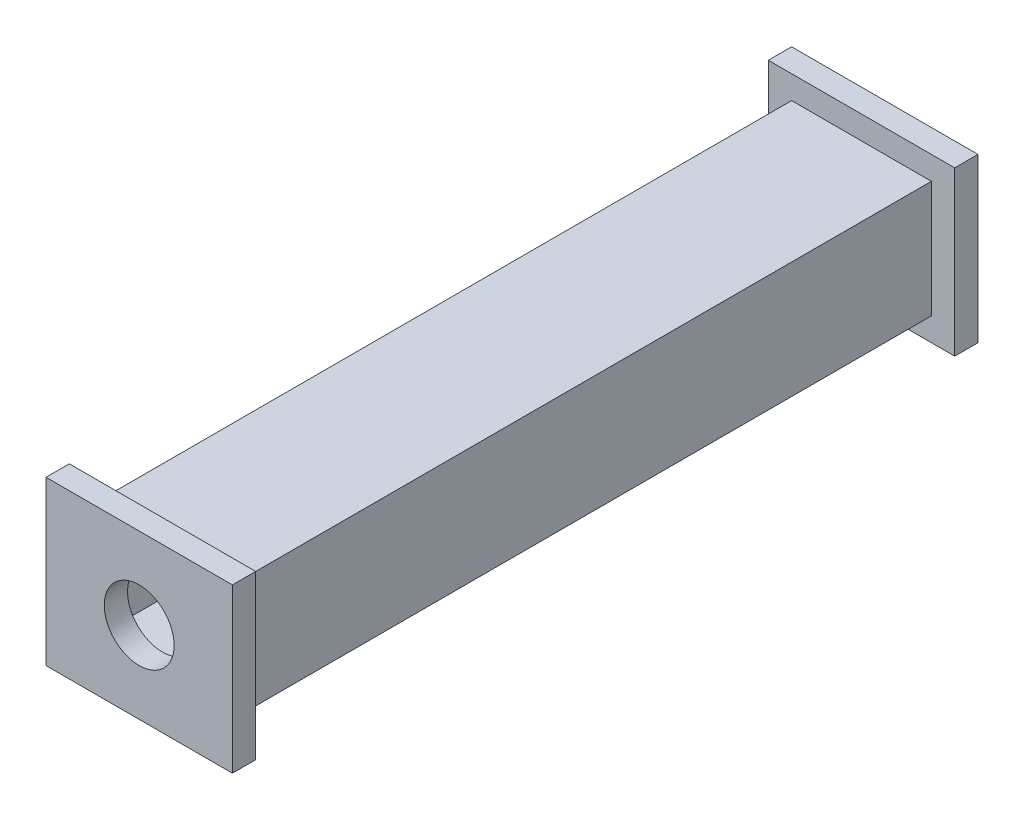
ISO-10303-21;
HEADER;
FILE_DESCRIPTION(('STEP AP214'),'2;1');
FILE_NAME('part.step','',(''),(''),'','','');
FILE_SCHEMA(('AUTOMOTIVE_DESIGN { 1 0 10303 214 1 1 1 1 }'));
ENDSEC;
DATA;
#1=APPLICATION_CONTEXT('core data for automotive mechanical design processes');
#2=APPLICATION_PROTOCOL_DEFINITION('international standard','automotive_design',2000,#1);
#3=PRODUCT_CONTEXT('',#1,'mechanical');
#4=PRODUCT('Part','Part','',(#3));
#5=PRODUCT_RELATED_PRODUCT_CATEGORY('part','',(#4));
#6=PRODUCT_DEFINITION_FORMATION('','',#4);
#7=PRODUCT_DEFINITION_CONTEXT('part definition',#1,'design');
#8=PRODUCT_DEFINITION('design','',#6,#7);
#9=PRODUCT_DEFINITION_SHAPE('','',#8);
#10=(LENGTH_UNIT() NAMED_UNIT(*) SI_UNIT(.MILLI.,.METRE.));
#11=(NAMED_UNIT(*) PLANE_ANGLE_UNIT() SI_UNIT($,.RADIAN.));
#12=(NAMED_UNIT(*) SI_UNIT($,.STERADIAN.) SOLID_ANGLE_UNIT());
#13=UNCERTAINTY_MEASURE_WITH_UNIT(LENGTH_MEASURE(1.E-05),#10,'distance_accuracy_value','');
#14=(GEOMETRIC_REPRESENTATION_CONTEXT(3) GLOBAL_UNCERTAINTY_ASSIGNED_CONTEXT((#13)) GLOBAL_UNIT_ASSIGNED_CONTEXT((#10,
#11,#12)) REPRESENTATION_CONTEXT('',''));
#15=CARTESIAN_POINT('',(0.,0.,0.));
#16=DIRECTION('',(0.,0.,1.));
#17=DIRECTION('',(1.,0.,0.));
#18=AXIS2_PLACEMENT_3D('',#15,#16,#17);
#19=CARTESIAN_POINT('',(-30.,25.,150.));
#20=DIRECTION('',(1.,0.,0.));
#21=DIRECTION('',(0.,0.,-1.));
#22=AXIS2_PLACEMENT_3D('',#19,#20,#21);
#23=PLANE('',#22);
#24=DIRECTION('',(0.,-1.,0.));
#25=VECTOR('',#24,1.);
#26=CARTESIAN_POINT('',(-30.,25.,-150.));
#27=LINE('',#26,#25);
#28=CARTESIAN_POINT('',(-30.,25.,-150.));
#29=VERTEX_POINT('',#28);
#30=CARTESIAN_POINT('',(-30.,-25.,-150.));
#31=VERTEX_POINT('',#30);
#32=EDGE_CURVE('E257',#29,#31,#27,.T.);
#33=ORIENTED_EDGE('',*,*,#32,.T.);
#34=DIRECTION('',(0.,0.,-1.));
#35=VECTOR('',#34,1.);
#36=CARTESIAN_POINT('',(-30.,-25.,150.));
#37=LINE('',#36,#35);
#38=CARTESIAN_POINT('',(-30.,-25.,150.));
#39=VERTEX_POINT('',#38);
#40=EDGE_CURVE('E11',#39,#31,#37,.T.);
#41=ORIENTED_EDGE('',*,*,#40,.F.);
#42=DIRECTION('',(0.,-1.,0.));
#43=VECTOR('',#42,1.);
#44=CARTESIAN_POINT('',(-30.,25.,150.));
#45=LINE('',#44,#43);
#46=CARTESIAN_POINT('',(-30.,25.,150.));
#47=VERTEX_POINT('',#46);
#48=EDGE_CURVE('E258',#47,#39,#45,.T.);
#49=ORIENTED_EDGE('',*,*,#48,.F.);
#50=DIRECTION('',(0.,0.,-1.));
#51=VECTOR('',#50,1.);
#52=CARTESIAN_POINT('',(-30.,25.,150.));
#53=LINE('',#52,#51);
#54=EDGE_CURVE('E271',#47,#29,#53,.T.);
#55=ORIENTED_EDGE('',*,*,#54,.T.);
#56=EDGE_LOOP('',(#33,#41,#49,#55));
#57=FACE_BOUND('',#56,.T.);
#58=ADVANCED_FACE('F39',(#57),#23,.F.);
#59=CARTESIAN_POINT('',(-30.,-25.,150.));
#60=DIRECTION('',(0.,1.,0.));
#61=DIRECTION('',(0.,0.,1.));
#62=AXIS2_PLACEMENT_3D('',#59,#60,#61);
#63=PLANE('',#62);
#64=DIRECTION('',(1.,0.,0.));
#65=VECTOR('',#64,1.);
#66=CARTESIAN_POINT('',(-30.,-25.,-150.));
#67=LINE('',#66,#65);
#68=CARTESIAN_POINT('',(30.,-25.,-150.));
#69=VERTEX_POINT('',#68);
#70=EDGE_CURVE('E274',#31,#69,#67,.T.);
#71=ORIENTED_EDGE('',*,*,#70,.T.);
#72=DIRECTION('',(0.,0.,-1.));
#73=VECTOR('',#72,1.);
#74=CARTESIAN_POINT('',(30.,-25.,150.));
#75=LINE('',#74,#73);
#76=CARTESIAN_POINT('',(30.,-25.,150.));
#77=VERTEX_POINT('',#76);
#78=EDGE_CURVE('E46',#77,#69,#75,.T.);
#79=ORIENTED_EDGE('',*,*,#78,.F.);
#80=DIRECTION('',(1.,0.,0.));
#81=VECTOR('',#80,1.);
#82=CARTESIAN_POINT('',(-30.,-25.,150.));
#83=LINE('',#82,#81);
#84=EDGE_CURVE('E261',#39,#77,#83,.T.);
#85=ORIENTED_EDGE('',*,*,#84,.F.);
#86=ORIENTED_EDGE('',*,*,#40,.T.);
#87=EDGE_LOOP('',(#71,#79,#85,#86));
#88=FACE_BOUND('',#87,.T.);
#89=ADVANCED_FACE('F284',(#88),#63,.F.);
#90=CARTESIAN_POINT('',(30.,25.,150.));
#91=DIRECTION('',(-1.,0.,0.));
#92=DIRECTION('',(0.,0.,1.));
#93=AXIS2_PLACEMENT_3D('',#90,#91,#92);
#94=PLANE('',#93);
#95=DIRECTION('',(0.,1.,0.));
#96=VECTOR('',#95,1.);
#97=CARTESIAN_POINT('',(30.,25.,-150.));
#98=LINE('',#97,#96);
#99=CARTESIAN_POINT('',(30.,25.,-150.));
#100=VERTEX_POINT('',#99);
#101=EDGE_CURVE('E74',#69,#100,#98,.T.);
#102=ORIENTED_EDGE('',*,*,#101,.T.);
#103=DIRECTION('',(0.,0.,-1.));
#104=VECTOR('',#103,1.);
#105=CARTESIAN_POINT('',(30.,25.,150.));
#106=LINE('',#105,#104);
#107=CARTESIAN_POINT('',(30.,25.,150.));
#108=VERTEX_POINT('',#107);
#109=EDGE_CURVE('E62',#108,#100,#106,.T.);
#110=ORIENTED_EDGE('',*,*,#109,.F.);
#111=DIRECTION('',(0.,1.,0.));
#112=VECTOR('',#111,1.);
#113=CARTESIAN_POINT('',(30.,25.,150.));
#114=LINE('',#113,#112);
#115=EDGE_CURVE('E265',#77,#108,#114,.T.);
#116=ORIENTED_EDGE('',*,*,#115,.F.);
#117=ORIENTED_EDGE('',*,*,#78,.T.);
#118=EDGE_LOOP('',(#102,#110,#116,#117));
#119=FACE_BOUND('',#118,.T.);
#120=ADVANCED_FACE('F282',(#119),#94,.F.);
#121=CARTESIAN_POINT('',(-30.,25.,150.));
#122=DIRECTION('',(0.,-1.,0.));
#123=DIRECTION('',(0.,0.,-1.));
#124=AXIS2_PLACEMENT_3D('',#121,#122,#123);
#125=PLANE('',#124);
#126=DIRECTION('',(-1.,0.,0.));
#127=VECTOR('',#126,1.);
#128=CARTESIAN_POINT('',(-30.,25.,-150.));
#129=LINE('',#128,#127);
#130=EDGE_CURVE('E262',#100,#29,#129,.T.);
#131=ORIENTED_EDGE('',*,*,#130,.T.);
#132=ORIENTED_EDGE('',*,*,#54,.F.);
#133=DIRECTION('',(-1.,0.,0.));
#134=VECTOR('',#133,1.);
#135=CARTESIAN_POINT('',(-30.,25.,150.));
#136=LINE('',#135,#134);
#137=EDGE_CURVE('E268',#108,#47,#136,.T.);
#138=ORIENTED_EDGE('',*,*,#137,.F.);
#139=ORIENTED_EDGE('',*,*,#109,.T.);
#140=EDGE_LOOP('',(#131,#132,#138,#139));
#141=FACE_BOUND('',#140,.T.);
#142=ADVANCED_FACE('F291',(#141),#125,.F.);
#143=CARTESIAN_POINT('',(-25.,20.,150.));
#144=DIRECTION('',(1.,0.,0.));
#145=DIRECTION('',(0.,0.,-1.));
#146=AXIS2_PLACEMENT_3D('',#143,#144,#145);
#147=PLANE('',#146);
#148=DIRECTION('',(0.,-1.,0.));
#149=VECTOR('',#148,1.);
#150=CARTESIAN_POINT('',(-25.,20.,-150.));
#151=LINE('',#150,#149);
#152=CARTESIAN_POINT('',(-25.,20.,-150.));
#153=VERTEX_POINT('',#152);
#154=CARTESIAN_POINT('',(-25.,-20.,-150.));
#155=VERTEX_POINT('',#154);
#156=EDGE_CURVE('E228',#153,#155,#151,.T.);
#157=ORIENTED_EDGE('',*,*,#156,.F.);
#158=DIRECTION('',(0.,0.,-1.));
#159=VECTOR('',#158,1.);
#160=CARTESIAN_POINT('',(-25.,20.,150.));
#161=LINE('',#160,#159);
#162=CARTESIAN_POINT('',(-25.,20.,150.));
#163=VERTEX_POINT('',#162);
#164=EDGE_CURVE('E239',#163,#153,#161,.T.);
#165=ORIENTED_EDGE('',*,*,#164,.F.);
#166=DIRECTION('',(0.,-1.,0.));
#167=VECTOR('',#166,1.);
#168=CARTESIAN_POINT('',(-25.,20.,150.));
#169=LINE('',#168,#167);
#170=CARTESIAN_POINT('',(-25.,-20.,150.));
#171=VERTEX_POINT('',#170);
#172=EDGE_CURVE('E229',#163,#171,#169,.T.);
#173=ORIENTED_EDGE('',*,*,#172,.T.);
#174=DIRECTION('',(0.,0.,-1.));
#175=VECTOR('',#174,1.);
#176=CARTESIAN_POINT('',(-25.,-20.,150.));
#177=LINE('',#176,#175);
#178=EDGE_CURVE('E254',#171,#155,#177,.T.);
#179=ORIENTED_EDGE('',*,*,#178,.T.);
#180=EDGE_LOOP('',(#157,#165,#173,#179));
#181=FACE_BOUND('',#180,.T.);
#182=ADVANCED_FACE('F325',(#181),#147,.T.);
#183=CARTESIAN_POINT('',(-25.,-20.,150.));
#184=DIRECTION('',(0.,1.,0.));
#185=DIRECTION('',(0.,0.,1.));
#186=AXIS2_PLACEMENT_3D('',#183,#184,#185);
#187=PLANE('',#186);
#188=DIRECTION('',(1.,0.,0.));
#189=VECTOR('',#188,1.);
#190=CARTESIAN_POINT('',(-25.,-20.,-150.));
#191=LINE('',#190,#189);
#192=CARTESIAN_POINT('',(25.,-20.,-150.));
#193=VERTEX_POINT('',#192);
#194=EDGE_CURVE('E242',#155,#193,#191,.T.);
#195=ORIENTED_EDGE('',*,*,#194,.F.);
#196=ORIENTED_EDGE('',*,*,#178,.F.);
#197=DIRECTION('',(1.,0.,0.));
#198=VECTOR('',#197,1.);
#199=CARTESIAN_POINT('',(-25.,-20.,150.));
#200=LINE('',#199,#198);
#201=CARTESIAN_POINT('',(25.,-20.,150.));
#202=VERTEX_POINT('',#201);
#203=EDGE_CURVE('E232',#171,#202,#200,.T.);
#204=ORIENTED_EDGE('',*,*,#203,.T.);
#205=DIRECTION('',(0.,0.,-1.));
#206=VECTOR('',#205,1.);
#207=CARTESIAN_POINT('',(25.,-20.,150.));
#208=LINE('',#207,#206);
#209=EDGE_CURVE('E252',#202,#193,#208,.T.);
#210=ORIENTED_EDGE('',*,*,#209,.T.);
#211=EDGE_LOOP('',(#195,#196,#204,#210));
#212=FACE_BOUND('',#211,.T.);
#213=ADVANCED_FACE('F328',(#212),#187,.T.);
#214=CARTESIAN_POINT('',(25.,20.,150.));
#215=DIRECTION('',(-1.,0.,0.));
#216=DIRECTION('',(0.,0.,1.));
#217=AXIS2_PLACEMENT_3D('',#214,#215,#216);
#218=PLANE('',#217);
#219=DIRECTION('',(0.,1.,0.));
#220=VECTOR('',#219,1.);
#221=CARTESIAN_POINT('',(25.,20.,-150.));
#222=LINE('',#221,#220);
#223=CARTESIAN_POINT('',(25.,20.,-150.));
#224=VERTEX_POINT('',#223);
#225=EDGE_CURVE('E245',#193,#224,#222,.T.);
#226=ORIENTED_EDGE('',*,*,#225,.F.);
#227=ORIENTED_EDGE('',*,*,#209,.F.);
#228=DIRECTION('',(0.,1.,0.));
#229=VECTOR('',#228,1.);
#230=CARTESIAN_POINT('',(25.,20.,150.));
#231=LINE('',#230,#229);
#232=CARTESIAN_POINT('',(25.,20.,150.));
#233=VERTEX_POINT('',#232);
#234=EDGE_CURVE('E236',#202,#233,#231,.T.);
#235=ORIENTED_EDGE('',*,*,#234,.T.);
#236=DIRECTION('',(0.,0.,-1.));
#237=VECTOR('',#236,1.);
#238=CARTESIAN_POINT('',(25.,20.,150.));
#239=LINE('',#238,#237);
#240=EDGE_CURVE('E83',#233,#224,#239,.T.);
#241=ORIENTED_EDGE('',*,*,#240,.T.);
#242=EDGE_LOOP('',(#226,#227,#235,#241));
#243=FACE_BOUND('',#242,.T.);
#244=ADVANCED_FACE('F306',(#243),#218,.T.);
#245=CARTESIAN_POINT('',(-25.,20.,150.));
#246=DIRECTION('',(0.,-1.,0.));
#247=DIRECTION('',(0.,0.,-1.));
#248=AXIS2_PLACEMENT_3D('',#245,#246,#247);
#249=PLANE('',#248);
#250=DIRECTION('',(-1.,0.,0.));
#251=VECTOR('',#250,1.);
#252=CARTESIAN_POINT('',(-25.,20.,-150.));
#253=LINE('',#252,#251);
#254=EDGE_CURVE('E233',#224,#153,#253,.T.);
#255=ORIENTED_EDGE('',*,*,#254,.F.);
#256=ORIENTED_EDGE('',*,*,#240,.F.);
#257=DIRECTION('',(-1.,0.,0.));
#258=VECTOR('',#257,1.);
#259=CARTESIAN_POINT('',(-25.,20.,150.));
#260=LINE('',#259,#258);
#261=EDGE_CURVE('E53',#233,#163,#260,.T.);
#262=ORIENTED_EDGE('',*,*,#261,.T.);
#263=ORIENTED_EDGE('',*,*,#164,.T.);
#264=EDGE_LOOP('',(#255,#256,#262,#263));
#265=FACE_BOUND('',#264,.T.);
#266=ADVANCED_FACE('F296',(#265),#249,.T.);
#267=CARTESIAN_POINT('',(0.,0.,150.));
#268=DIRECTION('',(0.,0.,1.));
#269=DIRECTION('',(1.,0.,0.));
#270=AXIS2_PLACEMENT_3D('',#267,#268,#269);
#271=PLANE('',#270);
#272=DIRECTION('',(0.,-1.,0.));
#273=VECTOR('',#272,1.);
#274=CARTESIAN_POINT('',(-40.,35.,150.));
#275=LINE('',#274,#273);
#276=CARTESIAN_POINT('',(-40.,35.,150.));
#277=VERTEX_POINT('',#276);
#278=CARTESIAN_POINT('',(-40.,-35.,150.));
#279=VERTEX_POINT('',#278);
#280=EDGE_CURVE('E197',#277,#279,#275,.T.);
#281=ORIENTED_EDGE('',*,*,#280,.F.);
#282=DIRECTION('',(-1.,0.,0.));
#283=VECTOR('',#282,1.);
#284=CARTESIAN_POINT('',(-40.,35.,150.));
#285=LINE('',#284,#283);
#286=CARTESIAN_POINT('',(40.,35.,150.));
#287=VERTEX_POINT('',#286);
#288=EDGE_CURVE('E203',#287,#277,#285,.T.);
#289=ORIENTED_EDGE('',*,*,#288,.F.);
#290=DIRECTION('',(0.,1.,0.));
#291=VECTOR('',#290,1.);
#292=CARTESIAN_POINT('',(40.,35.,150.));
#293=LINE('',#292,#291);
#294=CARTESIAN_POINT('',(40.,-35.,150.));
#295=VERTEX_POINT('',#294);
#296=EDGE_CURVE('E214',#295,#287,#293,.T.);
#297=ORIENTED_EDGE('',*,*,#296,.F.);
#298=DIRECTION('',(1.,0.,0.));
#299=VECTOR('',#298,1.);
#300=CARTESIAN_POINT('',(-40.,-35.,150.));
#301=LINE('',#300,#299);
#302=EDGE_CURVE('E212',#279,#295,#301,.T.);
#303=ORIENTED_EDGE('',*,*,#302,.F.);
#304=EDGE_LOOP('',(#281,#289,#297,#303));
#305=FACE_BOUND('',#304,.T.);
#306=ORIENTED_EDGE('',*,*,#137,.T.);
#307=ORIENTED_EDGE('',*,*,#48,.T.);
#308=ORIENTED_EDGE('',*,*,#84,.T.);
#309=ORIENTED_EDGE('',*,*,#115,.T.);
#310=EDGE_LOOP('',(#306,#307,#308,#309));
#311=FACE_BOUND('',#310,.T.);
#312=ADVANCED_FACE('F293',(#305,#311),#271,.F.);
#313=CARTESIAN_POINT('',(0.,0.,160.));
#314=DIRECTION('',(0.,0.,1.));
#315=DIRECTION('',(1.,0.,0.));
#316=AXIS2_PLACEMENT_3D('',#313,#314,#315);
#317=PLANE('',#316);
#318=DIRECTION('',(0.,-1.,0.));
#319=VECTOR('',#318,1.);
#320=CARTESIAN_POINT('',(-40.,35.,160.));
#321=LINE('',#320,#319);
#322=CARTESIAN_POINT('',(-40.,35.,160.));
#323=VERTEX_POINT('',#322);
#324=CARTESIAN_POINT('',(-40.,-35.,160.));
#325=VERTEX_POINT('',#324);
#326=EDGE_CURVE('E199',#323,#325,#321,.T.);
#327=ORIENTED_EDGE('',*,*,#326,.T.);
#328=DIRECTION('',(1.,0.,0.));
#329=VECTOR('',#328,1.);
#330=CARTESIAN_POINT('',(-40.,-35.,160.));
#331=LINE('',#330,#329);
#332=CARTESIAN_POINT('',(40.,-35.,160.));
#333=VERTEX_POINT('',#332);
#334=EDGE_CURVE('E202',#325,#333,#331,.T.);
#335=ORIENTED_EDGE('',*,*,#334,.T.);
#336=DIRECTION('',(0.,1.,0.));
#337=VECTOR('',#336,1.);
#338=CARTESIAN_POINT('',(40.,35.,160.));
#339=LINE('',#338,#337);
#340=CARTESIAN_POINT('',(40.,35.,160.));
#341=VERTEX_POINT('',#340);
#342=EDGE_CURVE('E205',#333,#341,#339,.T.);
#343=ORIENTED_EDGE('',*,*,#342,.T.);
#344=DIRECTION('',(-1.,0.,0.));
#345=VECTOR('',#344,1.);
#346=CARTESIAN_POINT('',(-40.,35.,160.));
#347=LINE('',#346,#345);
#348=EDGE_CURVE('E207',#341,#323,#347,.T.);
#349=ORIENTED_EDGE('',*,*,#348,.T.);
#350=EDGE_LOOP('',(#327,#335,#343,#349));
#351=FACE_BOUND('',#350,.T.);
#352=CARTESIAN_POINT('',(0.,0.,160.));
#353=DIRECTION('',(0.,0.,1.));
#354=DIRECTION('',(1.,0.,0.));
#355=AXIS2_PLACEMENT_3D('',#352,#353,#354);
#356=CIRCLE('',#355,15.);
#357=CARTESIAN_POINT('',(15.,0.,160.));
#358=VERTEX_POINT('',#357);
#359=EDGE_CURVE('E190',#358,#358,#356,.T.);
#360=ORIENTED_EDGE('',*,*,#359,.F.);
#361=EDGE_LOOP('',(#360));
#362=FACE_BOUND('',#361,.T.);
#363=ADVANCED_FACE('F295',(#351,#362),#317,.T.);
#364=ORIENTED_EDGE('',*,*,#203,.F.);
#365=ORIENTED_EDGE('',*,*,#172,.F.);
#366=ORIENTED_EDGE('',*,*,#261,.F.);
#367=ORIENTED_EDGE('',*,*,#234,.F.);
#368=EDGE_LOOP('',(#364,#365,#366,#367));
#369=FACE_BOUND('',#368,.T.);
#370=CARTESIAN_POINT('',(0.,0.,150.));
#371=DIRECTION('',(0.,0.,1.));
#372=DIRECTION('',(1.,0.,0.));
#373=AXIS2_PLACEMENT_3D('',#370,#371,#372);
#374=CIRCLE('',#373,15.);
#375=CARTESIAN_POINT('',(15.,0.,150.));
#376=VERTEX_POINT('',#375);
#377=EDGE_CURVE('E187',#376,#376,#374,.T.);
#378=ORIENTED_EDGE('',*,*,#377,.T.);
#379=EDGE_LOOP('',(#378));
#380=FACE_BOUND('',#379,.T.);
#381=ADVANCED_FACE('F299',(#369,#380),#271,.F.);
#382=CARTESIAN_POINT('',(-40.,35.,160.));
#383=DIRECTION('',(1.,0.,0.));
#384=DIRECTION('',(0.,0.,-1.));
#385=AXIS2_PLACEMENT_3D('',#382,#383,#384);
#386=PLANE('',#385);
#387=ORIENTED_EDGE('',*,*,#280,.T.);
#388=DIRECTION('',(0.,0.,-1.));
#389=VECTOR('',#388,1.);
#390=CARTESIAN_POINT('',(-40.,-35.,160.));
#391=LINE('',#390,#389);
#392=EDGE_CURVE('E225',#325,#279,#391,.T.);
#393=ORIENTED_EDGE('',*,*,#392,.F.);
#394=ORIENTED_EDGE('',*,*,#326,.F.);
#395=DIRECTION('',(0.,0.,-1.));
#396=VECTOR('',#395,1.);
#397=CARTESIAN_POINT('',(-40.,35.,160.));
#398=LINE('',#397,#396);
#399=EDGE_CURVE('E209',#323,#277,#398,.T.);
#400=ORIENTED_EDGE('',*,*,#399,.T.);
#401=EDGE_LOOP('',(#387,#393,#394,#400));
#402=FACE_BOUND('',#401,.T.);
#403=ADVANCED_FACE('F312',(#402),#386,.F.);
#404=CARTESIAN_POINT('',(-40.,-35.,160.));
#405=DIRECTION('',(0.,1.,0.));
#406=DIRECTION('',(0.,0.,1.));
#407=AXIS2_PLACEMENT_3D('',#404,#405,#406);
#408=PLANE('',#407);
#409=ORIENTED_EDGE('',*,*,#302,.T.);
#410=DIRECTION('',(0.,0.,-1.));
#411=VECTOR('',#410,1.);
#412=CARTESIAN_POINT('',(40.,-35.,160.));
#413=LINE('',#412,#411);
#414=EDGE_CURVE('E222',#333,#295,#413,.T.);
#415=ORIENTED_EDGE('',*,*,#414,.F.);
#416=ORIENTED_EDGE('',*,*,#334,.F.);
#417=ORIENTED_EDGE('',*,*,#392,.T.);
#418=EDGE_LOOP('',(#409,#415,#416,#417));
#419=FACE_BOUND('',#418,.T.);
#420=ADVANCED_FACE('F337',(#419),#408,.F.);
#421=CARTESIAN_POINT('',(40.,35.,160.));
#422=DIRECTION('',(-1.,0.,0.));
#423=DIRECTION('',(0.,0.,1.));
#424=AXIS2_PLACEMENT_3D('',#421,#422,#423);
#425=PLANE('',#424);
#426=ORIENTED_EDGE('',*,*,#296,.T.);
#427=DIRECTION('',(0.,0.,-1.));
#428=VECTOR('',#427,1.);
#429=CARTESIAN_POINT('',(40.,35.,160.));
#430=LINE('',#429,#428);
#431=EDGE_CURVE('E219',#341,#287,#430,.T.);
#432=ORIENTED_EDGE('',*,*,#431,.F.);
#433=ORIENTED_EDGE('',*,*,#342,.F.);
#434=ORIENTED_EDGE('',*,*,#414,.T.);
#435=EDGE_LOOP('',(#426,#432,#433,#434));
#436=FACE_BOUND('',#435,.T.);
#437=ADVANCED_FACE('F341',(#436),#425,.F.);
#438=CARTESIAN_POINT('',(-40.,35.,160.));
#439=DIRECTION('',(0.,-1.,0.));
#440=DIRECTION('',(0.,0.,-1.));
#441=AXIS2_PLACEMENT_3D('',#438,#439,#440);
#442=PLANE('',#441);
#443=ORIENTED_EDGE('',*,*,#288,.T.);
#444=ORIENTED_EDGE('',*,*,#399,.F.);
#445=ORIENTED_EDGE('',*,*,#348,.F.);
#446=ORIENTED_EDGE('',*,*,#431,.T.);
#447=EDGE_LOOP('',(#443,#444,#445,#446));
#448=FACE_BOUND('',#447,.T.);
#449=ADVANCED_FACE('F344',(#448),#442,.F.);
#450=CARTESIAN_POINT('',(0.,0.,160.));
#451=DIRECTION('',(0.,0.,-1.));
#452=DIRECTION('',(-1.,0.,0.));
#453=AXIS2_PLACEMENT_3D('',#450,#451,#452);
#454=CYLINDRICAL_SURFACE('',#453,15.);
#455=ORIENTED_EDGE('',*,*,#359,.T.);
#456=EDGE_LOOP('',(#455));
#457=FACE_BOUND('',#456,.T.);
#458=ORIENTED_EDGE('',*,*,#377,.F.);
#459=EDGE_LOOP('',(#458));
#460=FACE_BOUND('',#459,.T.);
#461=ADVANCED_FACE('F347',(#457,#460),#454,.F.);
#462=CARTESIAN_POINT('',(0.,0.,-150.));
#463=DIRECTION('',(0.,0.,-1.));
#464=DIRECTION('',(-1.,0.,0.));
#465=AXIS2_PLACEMENT_3D('',#462,#463,#464);
#466=PLANE('',#465);
#467=CARTESIAN_POINT('',(0.,0.,-150.));
#468=DIRECTION('',(0.,0.,-1.));
#469=DIRECTION('',(-1.,0.,0.));
#470=AXIS2_PLACEMENT_3D('',#467,#468,#469);
#471=CIRCLE('',#470,15.);
#472=CARTESIAN_POINT('',(-15.,0.,-150.));
#473=VERTEX_POINT('',#472);
#474=EDGE_CURVE('E400',#473,#473,#471,.T.);
#475=ORIENTED_EDGE('',*,*,#474,.T.);
#476=EDGE_LOOP('',(#475));
#477=FACE_BOUND('',#476,.T.);
#478=ORIENTED_EDGE('',*,*,#254,.T.);
#479=ORIENTED_EDGE('',*,*,#156,.T.);
#480=ORIENTED_EDGE('',*,*,#194,.T.);
#481=ORIENTED_EDGE('',*,*,#225,.T.);
#482=EDGE_LOOP('',(#478,#479,#480,#481));
#483=FACE_BOUND('',#482,.T.);
#484=ADVANCED_FACE('F351',(#477,#483),#466,.F.);
#485=CARTESIAN_POINT('',(0.,0.,-160.));
#486=DIRECTION('',(0.,0.,-1.));
#487=DIRECTION('',(-1.,0.,0.));
#488=AXIS2_PLACEMENT_3D('',#485,#486,#487);
#489=PLANE('',#488);
#490=DIRECTION('',(0.,-1.,0.));
#491=VECTOR('',#490,1.);
#492=CARTESIAN_POINT('',(40.,35.,-160.));
#493=LINE('',#492,#491);
#494=CARTESIAN_POINT('',(40.,35.,-160.));
#495=VERTEX_POINT('',#494);
#496=CARTESIAN_POINT('',(40.,-35.,-160.));
#497=VERTEX_POINT('',#496);
#498=EDGE_CURVE('E172',#495,#497,#493,.T.);
#499=ORIENTED_EDGE('',*,*,#498,.T.);
#500=DIRECTION('',(-1.,0.,0.));
#501=VECTOR('',#500,1.);
#502=CARTESIAN_POINT('',(40.,-35.,-160.));
#503=LINE('',#502,#501);
#504=CARTESIAN_POINT('',(-40.,-35.,-160.));
#505=VERTEX_POINT('',#504);
#506=EDGE_CURVE('E161',#497,#505,#503,.T.);
#507=ORIENTED_EDGE('',*,*,#506,.T.);
#508=DIRECTION('',(0.,1.,0.));
#509=VECTOR('',#508,1.);
#510=CARTESIAN_POINT('',(-40.,35.,-160.));
#511=LINE('',#510,#509);
#512=CARTESIAN_POINT('',(-40.,35.,-160.));
#513=VERTEX_POINT('',#512);
#514=EDGE_CURVE('E171',#505,#513,#511,.T.);
#515=ORIENTED_EDGE('',*,*,#514,.T.);
#516=DIRECTION('',(1.,0.,0.));
#517=VECTOR('',#516,1.);
#518=CARTESIAN_POINT('',(40.,35.,-160.));
#519=LINE('',#518,#517);
#520=EDGE_CURVE('E178',#513,#495,#519,.T.);
#521=ORIENTED_EDGE('',*,*,#520,.T.);
#522=EDGE_LOOP('',(#499,#507,#515,#521));
#523=FACE_BOUND('',#522,.T.);
#524=CARTESIAN_POINT('',(0.,0.,-160.));
#525=DIRECTION('',(0.,0.,-1.));
#526=DIRECTION('',(-1.,0.,0.));
#527=AXIS2_PLACEMENT_3D('',#524,#525,#526);
#528=CIRCLE('',#527,15.);
#529=CARTESIAN_POINT('',(-15.,0.,-160.));
#530=VERTEX_POINT('',#529);
#531=EDGE_CURVE('E397',#530,#530,#528,.T.);
#532=ORIENTED_EDGE('',*,*,#531,.F.);
#533=EDGE_LOOP('',(#532));
#534=FACE_BOUND('',#533,.T.);
#535=ADVANCED_FACE('F175',(#523,#534),#489,.T.);
#536=ORIENTED_EDGE('',*,*,#32,.F.);
#537=ORIENTED_EDGE('',*,*,#130,.F.);
#538=ORIENTED_EDGE('',*,*,#101,.F.);
#539=ORIENTED_EDGE('',*,*,#70,.F.);
#540=EDGE_LOOP('',(#536,#537,#538,#539));
#541=FACE_BOUND('',#540,.T.);
#542=DIRECTION('',(0.,-1.,0.));
#543=VECTOR('',#542,1.);
#544=CARTESIAN_POINT('',(40.,35.,-150.));
#545=LINE('',#544,#543);
#546=CARTESIAN_POINT('',(40.,35.,-150.));
#547=VERTEX_POINT('',#546);
#548=CARTESIAN_POINT('',(40.,-35.,-150.));
#549=VERTEX_POINT('',#548);
#550=EDGE_CURVE('E186',#547,#549,#545,.T.);
#551=ORIENTED_EDGE('',*,*,#550,.F.);
#552=DIRECTION('',(1.,0.,0.));
#553=VECTOR('',#552,1.);
#554=CARTESIAN_POINT('',(40.,35.,-150.));
#555=LINE('',#554,#553);
#556=CARTESIAN_POINT('',(-40.,35.,-150.));
#557=VERTEX_POINT('',#556);
#558=EDGE_CURVE('E182',#557,#547,#555,.T.);
#559=ORIENTED_EDGE('',*,*,#558,.F.);
#560=DIRECTION('',(0.,1.,0.));
#561=VECTOR('',#560,1.);
#562=CARTESIAN_POINT('',(-40.,35.,-150.));
#563=LINE('',#562,#561);
#564=CARTESIAN_POINT('',(-40.,-35.,-150.));
#565=VERTEX_POINT('',#564);
#566=EDGE_CURVE('E410',#565,#557,#563,.T.);
#567=ORIENTED_EDGE('',*,*,#566,.F.);
#568=DIRECTION('',(-1.,0.,0.));
#569=VECTOR('',#568,1.);
#570=CARTESIAN_POINT('',(40.,-35.,-150.));
#571=LINE('',#570,#569);
#572=EDGE_CURVE('E408',#549,#565,#571,.T.);
#573=ORIENTED_EDGE('',*,*,#572,.F.);
#574=EDGE_LOOP('',(#551,#559,#567,#573));
#575=FACE_BOUND('',#574,.T.);
#576=ADVANCED_FACE('F286',(#541,#575),#466,.F.);
#577=CARTESIAN_POINT('',(40.,35.,-160.));
#578=DIRECTION('',(-1.,0.,0.));
#579=DIRECTION('',(0.,0.,1.));
#580=AXIS2_PLACEMENT_3D('',#577,#578,#579);
#581=PLANE('',#580);
#582=ORIENTED_EDGE('',*,*,#550,.T.);
#583=DIRECTION('',(0.,0.,1.));
#584=VECTOR('',#583,1.);
#585=CARTESIAN_POINT('',(40.,-35.,-160.));
#586=LINE('',#585,#584);
#587=EDGE_CURVE('E165',#497,#549,#586,.T.);
#588=ORIENTED_EDGE('',*,*,#587,.F.);
#589=ORIENTED_EDGE('',*,*,#498,.F.);
#590=DIRECTION('',(0.,0.,1.));
#591=VECTOR('',#590,1.);
#592=CARTESIAN_POINT('',(40.,35.,-160.));
#593=LINE('',#592,#591);
#594=EDGE_CURVE('E406',#495,#547,#593,.T.);
#595=ORIENTED_EDGE('',*,*,#594,.T.);
#596=EDGE_LOOP('',(#582,#588,#589,#595));
#597=FACE_BOUND('',#596,.T.);
#598=ADVANCED_FACE('F184',(#597),#581,.F.);
#599=CARTESIAN_POINT('',(40.,-35.,-160.));
#600=DIRECTION('',(0.,1.,0.));
#601=DIRECTION('',(0.,0.,1.));
#602=AXIS2_PLACEMENT_3D('',#599,#600,#601);
#603=PLANE('',#602);
#604=ORIENTED_EDGE('',*,*,#572,.T.);
#605=DIRECTION('',(0.,0.,1.));
#606=VECTOR('',#605,1.);
#607=CARTESIAN_POINT('',(-40.,-35.,-160.));
#608=LINE('',#607,#606);
#609=EDGE_CURVE('E168',#505,#565,#608,.T.);
#610=ORIENTED_EDGE('',*,*,#609,.F.);
#611=ORIENTED_EDGE('',*,*,#506,.F.);
#612=ORIENTED_EDGE('',*,*,#587,.T.);
#613=EDGE_LOOP('',(#604,#610,#611,#612));
#614=FACE_BOUND('',#613,.T.);
#615=ADVANCED_FACE('F163',(#614),#603,.F.);
#616=CARTESIAN_POINT('',(-40.,35.,-160.));
#617=DIRECTION('',(1.,0.,0.));
#618=DIRECTION('',(0.,0.,-1.));
#619=AXIS2_PLACEMENT_3D('',#616,#617,#618);
#620=PLANE('',#619);
#621=ORIENTED_EDGE('',*,*,#566,.T.);
#622=DIRECTION('',(0.,0.,1.));
#623=VECTOR('',#622,1.);
#624=CARTESIAN_POINT('',(-40.,35.,-160.));
#625=LINE('',#624,#623);
#626=EDGE_CURVE('E192',#513,#557,#625,.T.);
#627=ORIENTED_EDGE('',*,*,#626,.F.);
#628=ORIENTED_EDGE('',*,*,#514,.F.);
#629=ORIENTED_EDGE('',*,*,#609,.T.);
#630=EDGE_LOOP('',(#621,#627,#628,#629));
#631=FACE_BOUND('',#630,.T.);
#632=ADVANCED_FACE('F378',(#631),#620,.F.);
#633=CARTESIAN_POINT('',(40.,35.,-160.));
#634=DIRECTION('',(0.,-1.,0.));
#635=DIRECTION('',(0.,0.,-1.));
#636=AXIS2_PLACEMENT_3D('',#633,#634,#635);
#637=PLANE('',#636);
#638=ORIENTED_EDGE('',*,*,#558,.T.);
#639=ORIENTED_EDGE('',*,*,#594,.F.);
#640=ORIENTED_EDGE('',*,*,#520,.F.);
#641=ORIENTED_EDGE('',*,*,#626,.T.);
#642=EDGE_LOOP('',(#638,#639,#640,#641));
#643=FACE_BOUND('',#642,.T.);
#644=ADVANCED_FACE('F381',(#643),#637,.F.);
#645=CARTESIAN_POINT('',(0.,0.,-160.));
#646=DIRECTION('',(0.,0.,1.));
#647=DIRECTION('',(1.,0.,0.));
#648=AXIS2_PLACEMENT_3D('',#645,#646,#647);
#649=CYLINDRICAL_SURFACE('',#648,15.);
#650=ORIENTED_EDGE('',*,*,#531,.T.);
#651=EDGE_LOOP('',(#650));
#652=FACE_BOUND('',#651,.T.);
#653=ORIENTED_EDGE('',*,*,#474,.F.);
#654=EDGE_LOOP('',(#653));
#655=FACE_BOUND('',#654,.T.);
#656=ADVANCED_FACE('F384',(#652,#655),#649,.F.);
#657=CLOSED_SHELL('',(#58,#89,#120,#142,#182,#213,#244,#266,#312,#363,#381,#403,#420,#437,#449,
#461,#484,#535,#576,#598,#615,#632,#644,#656));
#658=MANIFOLD_SOLID_BREP('B2',#657);
#659=ADVANCED_BREP_SHAPE_REPRESENTATION('',(#18,#658),#14);
#660=SHAPE_DEFINITION_REPRESENTATION(#9,#659);
ENDSEC;
END-ISO-10303-21;
